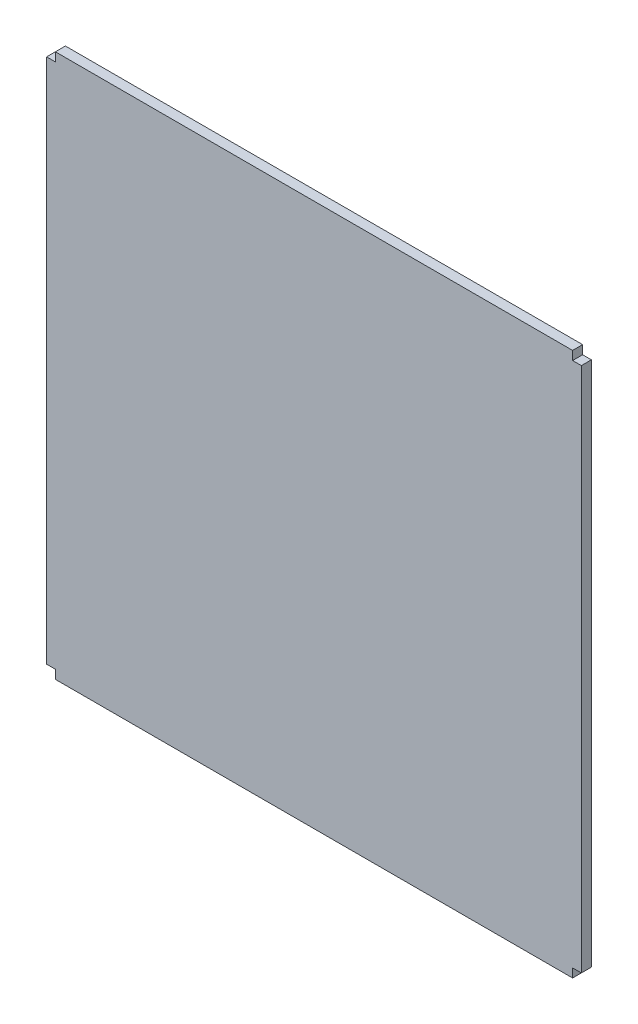
ISO-10303-21;
HEADER;
FILE_DESCRIPTION(('STEP AP214'),'2;1');
FILE_NAME('part.step','',(''),(''),'','','');
FILE_SCHEMA(('AUTOMOTIVE_DESIGN { 1 0 10303 214 1 1 1 1 }'));
ENDSEC;
DATA;
#1=APPLICATION_CONTEXT('core data for automotive mechanical design processes');
#2=APPLICATION_PROTOCOL_DEFINITION('international standard','automotive_design',2000,#1);
#3=PRODUCT_CONTEXT('',#1,'mechanical');
#4=PRODUCT('Part','Part','',(#3));
#5=PRODUCT_RELATED_PRODUCT_CATEGORY('part','',(#4));
#6=PRODUCT_DEFINITION_FORMATION('','',#4);
#7=PRODUCT_DEFINITION_CONTEXT('part definition',#1,'design');
#8=PRODUCT_DEFINITION('design','',#6,#7);
#9=PRODUCT_DEFINITION_SHAPE('','',#8);
#10=(LENGTH_UNIT() NAMED_UNIT(*) SI_UNIT(.MILLI.,.METRE.));
#11=(NAMED_UNIT(*) PLANE_ANGLE_UNIT() SI_UNIT($,.RADIAN.));
#12=(NAMED_UNIT(*) SI_UNIT($,.STERADIAN.) SOLID_ANGLE_UNIT());
#13=UNCERTAINTY_MEASURE_WITH_UNIT(LENGTH_MEASURE(1.E-05),#10,'distance_accuracy_value','');
#14=(GEOMETRIC_REPRESENTATION_CONTEXT(3) GLOBAL_UNCERTAINTY_ASSIGNED_CONTEXT((#13)) GLOBAL_UNIT_ASSIGNED_CONTEXT((#10,
#11,#12)) REPRESENTATION_CONTEXT('',''));
#15=CARTESIAN_POINT('',(0.,0.,0.));
#16=DIRECTION('',(0.,0.,1.));
#17=DIRECTION('',(1.,0.,0.));
#18=AXIS2_PLACEMENT_3D('',#15,#16,#17);
#19=CARTESIAN_POINT('',(0.,0.,8.));
#20=DIRECTION('',(0.,0.,-1.));
#21=DIRECTION('',(-1.,0.,0.));
#22=AXIS2_PLACEMENT_3D('',#19,#20,#21);
#23=PLANE('',#22);
#24=DIRECTION('',(1.,0.,0.));
#25=VECTOR('',#24,1.);
#26=CARTESIAN_POINT('',(-213.5,-210.,8.));
#27=LINE('',#26,#25);
#28=CARTESIAN_POINT('',(-213.5,-210.,8.));
#29=VERTEX_POINT('',#28);
#30=CARTESIAN_POINT('',(-206.5,-210.,8.));
#31=VERTEX_POINT('',#30);
#32=EDGE_CURVE('E141',#29,#31,#27,.T.);
#33=ORIENTED_EDGE('',*,*,#32,.T.);
#34=DIRECTION('',(0.,-1.,0.));
#35=VECTOR('',#34,1.);
#36=CARTESIAN_POINT('',(-206.5,-217.,8.));
#37=LINE('',#36,#35);
#38=CARTESIAN_POINT('',(-206.5,-217.,8.));
#39=VERTEX_POINT('',#38);
#40=EDGE_CURVE('E135',#31,#39,#37,.T.);
#41=ORIENTED_EDGE('',*,*,#40,.T.);
#42=DIRECTION('',(1.,0.,0.));
#43=VECTOR('',#42,1.);
#44=CARTESIAN_POINT('',(-213.5,-217.,8.));
#45=LINE('',#44,#43);
#46=CARTESIAN_POINT('',(206.5,-217.,8.));
#47=VERTEX_POINT('',#46);
#48=EDGE_CURVE('E11',#39,#47,#45,.T.);
#49=ORIENTED_EDGE('',*,*,#48,.T.);
#50=DIRECTION('',(0.,-1.,0.));
#51=VECTOR('',#50,1.);
#52=CARTESIAN_POINT('',(206.5,-217.,8.));
#53=LINE('',#52,#51);
#54=CARTESIAN_POINT('',(206.5,-210.,8.));
#55=VERTEX_POINT('',#54);
#56=EDGE_CURVE('E153',#55,#47,#53,.T.);
#57=ORIENTED_EDGE('',*,*,#56,.F.);
#58=DIRECTION('',(-1.,0.,0.));
#59=VECTOR('',#58,1.);
#60=CARTESIAN_POINT('',(213.5,-210.,8.));
#61=LINE('',#60,#59);
#62=CARTESIAN_POINT('',(213.5,-210.,8.));
#63=VERTEX_POINT('',#62);
#64=EDGE_CURVE('E146',#63,#55,#61,.T.);
#65=ORIENTED_EDGE('',*,*,#64,.F.);
#66=DIRECTION('',(0.,1.,0.));
#67=VECTOR('',#66,1.);
#68=CARTESIAN_POINT('',(213.5,-217.,8.));
#69=LINE('',#68,#67);
#70=CARTESIAN_POINT('',(213.5,210.,8.));
#71=VERTEX_POINT('',#70);
#72=EDGE_CURVE('E203',#63,#71,#69,.T.);
#73=ORIENTED_EDGE('',*,*,#72,.T.);
#74=DIRECTION('',(-1.,0.,0.));
#75=VECTOR('',#74,1.);
#76=CARTESIAN_POINT('',(213.5,210.,8.));
#77=LINE('',#76,#75);
#78=CARTESIAN_POINT('',(206.5,210.,8.));
#79=VERTEX_POINT('',#78);
#80=EDGE_CURVE('E169',#71,#79,#77,.T.);
#81=ORIENTED_EDGE('',*,*,#80,.T.);
#82=DIRECTION('',(0.,1.,0.));
#83=VECTOR('',#82,1.);
#84=CARTESIAN_POINT('',(206.5,217.,8.));
#85=LINE('',#84,#83);
#86=CARTESIAN_POINT('',(206.5,217.,8.));
#87=VERTEX_POINT('',#86);
#88=EDGE_CURVE('E162',#79,#87,#85,.T.);
#89=ORIENTED_EDGE('',*,*,#88,.T.);
#90=DIRECTION('',(-1.,0.,0.));
#91=VECTOR('',#90,1.);
#92=CARTESIAN_POINT('',(-213.5,217.,8.));
#93=LINE('',#92,#91);
#94=CARTESIAN_POINT('',(-206.5,217.,8.));
#95=VERTEX_POINT('',#94);
#96=EDGE_CURVE('E205',#87,#95,#93,.T.);
#97=ORIENTED_EDGE('',*,*,#96,.T.);
#98=DIRECTION('',(0.,1.,0.));
#99=VECTOR('',#98,1.);
#100=CARTESIAN_POINT('',(-206.5,217.,8.));
#101=LINE('',#100,#99);
#102=CARTESIAN_POINT('',(-206.5,210.,8.));
#103=VERTEX_POINT('',#102);
#104=EDGE_CURVE('E188',#103,#95,#101,.T.);
#105=ORIENTED_EDGE('',*,*,#104,.F.);
#106=DIRECTION('',(1.,0.,0.));
#107=VECTOR('',#106,1.);
#108=CARTESIAN_POINT('',(-213.5,210.,8.));
#109=LINE('',#108,#107);
#110=CARTESIAN_POINT('',(-213.5,210.,8.));
#111=VERTEX_POINT('',#110);
#112=EDGE_CURVE('E180',#111,#103,#109,.T.);
#113=ORIENTED_EDGE('',*,*,#112,.F.);
#114=DIRECTION('',(0.,-1.,0.));
#115=VECTOR('',#114,1.);
#116=CARTESIAN_POINT('',(-213.5,-217.,8.));
#117=LINE('',#116,#115);
#118=EDGE_CURVE('E41',#111,#29,#117,.T.);
#119=ORIENTED_EDGE('',*,*,#118,.T.);
#120=EDGE_LOOP('',(#33,#41,#49,#57,#65,#73,#81,#89,#97,#105,#113,#119));
#121=FACE_BOUND('',#120,.T.);
#122=ADVANCED_FACE('F32',(#121),#23,.F.);
#123=CARTESIAN_POINT('',(0.,0.,0.));
#124=DIRECTION('',(0.,0.,-1.));
#125=DIRECTION('',(-1.,0.,0.));
#126=AXIS2_PLACEMENT_3D('',#123,#124,#125);
#127=PLANE('',#126);
#128=DIRECTION('',(0.,-1.,0.));
#129=VECTOR('',#128,1.);
#130=CARTESIAN_POINT('',(-206.5,-217.,0.));
#131=LINE('',#130,#129);
#132=CARTESIAN_POINT('',(-206.5,-210.,0.));
#133=VERTEX_POINT('',#132);
#134=CARTESIAN_POINT('',(-206.5,-217.,0.));
#135=VERTEX_POINT('',#134);
#136=EDGE_CURVE('E49',#133,#135,#131,.T.);
#137=ORIENTED_EDGE('',*,*,#136,.F.);
#138=DIRECTION('',(1.,0.,0.));
#139=VECTOR('',#138,1.);
#140=CARTESIAN_POINT('',(-213.5,-210.,0.));
#141=LINE('',#140,#139);
#142=CARTESIAN_POINT('',(-213.5,-210.,0.));
#143=VERTEX_POINT('',#142);
#144=EDGE_CURVE('E123',#143,#133,#141,.T.);
#145=ORIENTED_EDGE('',*,*,#144,.F.);
#146=DIRECTION('',(0.,-1.,0.));
#147=VECTOR('',#146,1.);
#148=CARTESIAN_POINT('',(-213.5,-217.,0.));
#149=LINE('',#148,#147);
#150=CARTESIAN_POINT('',(-213.5,210.,0.));
#151=VERTEX_POINT('',#150);
#152=EDGE_CURVE('E211',#151,#143,#149,.T.);
#153=ORIENTED_EDGE('',*,*,#152,.F.);
#154=DIRECTION('',(1.,0.,0.));
#155=VECTOR('',#154,1.);
#156=CARTESIAN_POINT('',(-213.5,210.,0.));
#157=LINE('',#156,#155);
#158=CARTESIAN_POINT('',(-206.5,210.,0.));
#159=VERTEX_POINT('',#158);
#160=EDGE_CURVE('E184',#151,#159,#157,.T.);
#161=ORIENTED_EDGE('',*,*,#160,.T.);
#162=DIRECTION('',(0.,1.,0.));
#163=VECTOR('',#162,1.);
#164=CARTESIAN_POINT('',(-206.5,217.,0.));
#165=LINE('',#164,#163);
#166=CARTESIAN_POINT('',(-206.5,217.,0.));
#167=VERTEX_POINT('',#166);
#168=EDGE_CURVE('E187',#159,#167,#165,.T.);
#169=ORIENTED_EDGE('',*,*,#168,.T.);
#170=DIRECTION('',(-1.,0.,0.));
#171=VECTOR('',#170,1.);
#172=CARTESIAN_POINT('',(-213.5,217.,0.));
#173=LINE('',#172,#171);
#174=CARTESIAN_POINT('',(206.5,217.,0.));
#175=VERTEX_POINT('',#174);
#176=EDGE_CURVE('E210',#175,#167,#173,.T.);
#177=ORIENTED_EDGE('',*,*,#176,.F.);
#178=DIRECTION('',(0.,1.,0.));
#179=VECTOR('',#178,1.);
#180=CARTESIAN_POINT('',(206.5,217.,0.));
#181=LINE('',#180,#179);
#182=CARTESIAN_POINT('',(206.5,210.,0.));
#183=VERTEX_POINT('',#182);
#184=EDGE_CURVE('E166',#183,#175,#181,.T.);
#185=ORIENTED_EDGE('',*,*,#184,.F.);
#186=DIRECTION('',(-1.,0.,0.));
#187=VECTOR('',#186,1.);
#188=CARTESIAN_POINT('',(213.5,210.,0.));
#189=LINE('',#188,#187);
#190=CARTESIAN_POINT('',(213.5,210.,0.));
#191=VERTEX_POINT('',#190);
#192=EDGE_CURVE('E168',#191,#183,#189,.T.);
#193=ORIENTED_EDGE('',*,*,#192,.F.);
#194=DIRECTION('',(0.,1.,0.));
#195=VECTOR('',#194,1.);
#196=CARTESIAN_POINT('',(213.5,-217.,0.));
#197=LINE('',#196,#195);
#198=CARTESIAN_POINT('',(213.5,-210.,0.));
#199=VERTEX_POINT('',#198);
#200=EDGE_CURVE('E199',#199,#191,#197,.T.);
#201=ORIENTED_EDGE('',*,*,#200,.F.);
#202=DIRECTION('',(-1.,0.,0.));
#203=VECTOR('',#202,1.);
#204=CARTESIAN_POINT('',(213.5,-210.,0.));
#205=LINE('',#204,#203);
#206=CARTESIAN_POINT('',(206.5,-210.,0.));
#207=VERTEX_POINT('',#206);
#208=EDGE_CURVE('E149',#199,#207,#205,.T.);
#209=ORIENTED_EDGE('',*,*,#208,.T.);
#210=DIRECTION('',(0.,-1.,0.));
#211=VECTOR('',#210,1.);
#212=CARTESIAN_POINT('',(206.5,-217.,0.));
#213=LINE('',#212,#211);
#214=CARTESIAN_POINT('',(206.5,-217.,0.));
#215=VERTEX_POINT('',#214);
#216=EDGE_CURVE('E152',#207,#215,#213,.T.);
#217=ORIENTED_EDGE('',*,*,#216,.T.);
#218=DIRECTION('',(1.,0.,0.));
#219=VECTOR('',#218,1.);
#220=CARTESIAN_POINT('',(-213.5,-217.,0.));
#221=LINE('',#220,#219);
#222=EDGE_CURVE('E36',#135,#215,#221,.T.);
#223=ORIENTED_EDGE('',*,*,#222,.F.);
#224=EDGE_LOOP('',(#137,#145,#153,#161,#169,#177,#185,#193,#201,#209,#217,#223));
#225=FACE_BOUND('',#224,.T.);
#226=ADVANCED_FACE('F139',(#225),#127,.T.);
#227=CARTESIAN_POINT('',(-213.5,-217.,8.));
#228=DIRECTION('',(1.,0.,0.));
#229=DIRECTION('',(0.,0.,-1.));
#230=AXIS2_PLACEMENT_3D('',#227,#228,#229);
#231=PLANE('',#230);
#232=DIRECTION('',(0.,0.,1.));
#233=VECTOR('',#232,1.);
#234=CARTESIAN_POINT('',(-213.5,-210.,0.));
#235=LINE('',#234,#233);
#236=EDGE_CURVE('E128',#143,#29,#235,.T.);
#237=ORIENTED_EDGE('',*,*,#236,.T.);
#238=ORIENTED_EDGE('',*,*,#118,.F.);
#239=DIRECTION('',(0.,0.,1.));
#240=VECTOR('',#239,1.);
#241=CARTESIAN_POINT('',(-213.5,210.,0.));
#242=LINE('',#241,#240);
#243=EDGE_CURVE('E191',#151,#111,#242,.T.);
#244=ORIENTED_EDGE('',*,*,#243,.F.);
#245=ORIENTED_EDGE('',*,*,#152,.T.);
#246=EDGE_LOOP('',(#237,#238,#244,#245));
#247=FACE_BOUND('',#246,.T.);
#248=ADVANCED_FACE('F250',(#247),#231,.F.);
#249=CARTESIAN_POINT('',(-213.5,-217.,8.));
#250=DIRECTION('',(0.,1.,0.));
#251=DIRECTION('',(0.,0.,1.));
#252=AXIS2_PLACEMENT_3D('',#249,#250,#251);
#253=PLANE('',#252);
#254=DIRECTION('',(0.,0.,1.));
#255=VECTOR('',#254,1.);
#256=CARTESIAN_POINT('',(-206.5,-217.,0.));
#257=LINE('',#256,#255);
#258=EDGE_CURVE('E132',#135,#39,#257,.T.);
#259=ORIENTED_EDGE('',*,*,#258,.F.);
#260=ORIENTED_EDGE('',*,*,#222,.T.);
#261=DIRECTION('',(0.,0.,1.));
#262=VECTOR('',#261,1.);
#263=CARTESIAN_POINT('',(206.5,-217.,0.));
#264=LINE('',#263,#262);
#265=EDGE_CURVE('E159',#215,#47,#264,.T.);
#266=ORIENTED_EDGE('',*,*,#265,.T.);
#267=ORIENTED_EDGE('',*,*,#48,.F.);
#268=EDGE_LOOP('',(#259,#260,#266,#267));
#269=FACE_BOUND('',#268,.T.);
#270=ADVANCED_FACE('F216',(#269),#253,.F.);
#271=CARTESIAN_POINT('',(213.5,-217.,8.));
#272=DIRECTION('',(-1.,0.,0.));
#273=DIRECTION('',(0.,0.,1.));
#274=AXIS2_PLACEMENT_3D('',#271,#272,#273);
#275=PLANE('',#274);
#276=ORIENTED_EDGE('',*,*,#72,.F.);
#277=DIRECTION('',(0.,0.,1.));
#278=VECTOR('',#277,1.);
#279=CARTESIAN_POINT('',(213.5,-210.,0.));
#280=LINE('',#279,#278);
#281=EDGE_CURVE('E155',#199,#63,#280,.T.);
#282=ORIENTED_EDGE('',*,*,#281,.F.);
#283=ORIENTED_EDGE('',*,*,#200,.T.);
#284=DIRECTION('',(0.,0.,1.));
#285=VECTOR('',#284,1.);
#286=CARTESIAN_POINT('',(213.5,210.,0.));
#287=LINE('',#286,#285);
#288=EDGE_CURVE('E177',#191,#71,#287,.T.);
#289=ORIENTED_EDGE('',*,*,#288,.T.);
#290=EDGE_LOOP('',(#276,#282,#283,#289));
#291=FACE_BOUND('',#290,.T.);
#292=ADVANCED_FACE('F34',(#291),#275,.F.);
#293=CARTESIAN_POINT('',(-213.5,217.,8.));
#294=DIRECTION('',(0.,-1.,0.));
#295=DIRECTION('',(0.,0.,-1.));
#296=AXIS2_PLACEMENT_3D('',#293,#294,#295);
#297=PLANE('',#296);
#298=DIRECTION('',(0.,0.,1.));
#299=VECTOR('',#298,1.);
#300=CARTESIAN_POINT('',(206.5,217.,0.));
#301=LINE('',#300,#299);
#302=EDGE_CURVE('E172',#175,#87,#301,.T.);
#303=ORIENTED_EDGE('',*,*,#302,.F.);
#304=ORIENTED_EDGE('',*,*,#176,.T.);
#305=DIRECTION('',(0.,0.,1.));
#306=VECTOR('',#305,1.);
#307=CARTESIAN_POINT('',(-206.5,217.,0.));
#308=LINE('',#307,#306);
#309=EDGE_CURVE('E196',#167,#95,#308,.T.);
#310=ORIENTED_EDGE('',*,*,#309,.T.);
#311=ORIENTED_EDGE('',*,*,#96,.F.);
#312=EDGE_LOOP('',(#303,#304,#310,#311));
#313=FACE_BOUND('',#312,.T.);
#314=ADVANCED_FACE('F240',(#313),#297,.F.);
#315=CARTESIAN_POINT('',(-206.5,217.,0.));
#316=DIRECTION('',(1.,0.,0.));
#317=DIRECTION('',(0.,0.,-1.));
#318=AXIS2_PLACEMENT_3D('',#315,#316,#317);
#319=PLANE('',#318);
#320=ORIENTED_EDGE('',*,*,#104,.T.);
#321=ORIENTED_EDGE('',*,*,#309,.F.);
#322=ORIENTED_EDGE('',*,*,#168,.F.);
#323=DIRECTION('',(0.,0.,1.));
#324=VECTOR('',#323,1.);
#325=CARTESIAN_POINT('',(-206.5,210.,0.));
#326=LINE('',#325,#324);
#327=EDGE_CURVE('E200',#159,#103,#326,.T.);
#328=ORIENTED_EDGE('',*,*,#327,.T.);
#329=EDGE_LOOP('',(#320,#321,#322,#328));
#330=FACE_BOUND('',#329,.T.);
#331=ADVANCED_FACE('F244',(#330),#319,.F.);
#332=CARTESIAN_POINT('',(-213.5,210.,0.));
#333=DIRECTION('',(0.,-1.,0.));
#334=DIRECTION('',(0.,0.,-1.));
#335=AXIS2_PLACEMENT_3D('',#332,#333,#334);
#336=PLANE('',#335);
#337=ORIENTED_EDGE('',*,*,#112,.T.);
#338=ORIENTED_EDGE('',*,*,#327,.F.);
#339=ORIENTED_EDGE('',*,*,#160,.F.);
#340=ORIENTED_EDGE('',*,*,#243,.T.);
#341=EDGE_LOOP('',(#337,#338,#339,#340));
#342=FACE_BOUND('',#341,.T.);
#343=ADVANCED_FACE('F247',(#342),#336,.F.);
#344=CARTESIAN_POINT('',(213.5,210.,0.));
#345=DIRECTION('',(0.,1.,0.));
#346=DIRECTION('',(0.,0.,1.));
#347=AXIS2_PLACEMENT_3D('',#344,#345,#346);
#348=PLANE('',#347);
#349=ORIENTED_EDGE('',*,*,#80,.F.);
#350=ORIENTED_EDGE('',*,*,#288,.F.);
#351=ORIENTED_EDGE('',*,*,#192,.T.);
#352=DIRECTION('',(0.,0.,1.));
#353=VECTOR('',#352,1.);
#354=CARTESIAN_POINT('',(206.5,210.,0.));
#355=LINE('',#354,#353);
#356=EDGE_CURVE('E181',#183,#79,#355,.T.);
#357=ORIENTED_EDGE('',*,*,#356,.T.);
#358=EDGE_LOOP('',(#349,#350,#351,#357));
#359=FACE_BOUND('',#358,.T.);
#360=ADVANCED_FACE('F231',(#359),#348,.T.);
#361=CARTESIAN_POINT('',(206.5,217.,0.));
#362=DIRECTION('',(1.,0.,0.));
#363=DIRECTION('',(0.,0.,-1.));
#364=AXIS2_PLACEMENT_3D('',#361,#362,#363);
#365=PLANE('',#364);
#366=ORIENTED_EDGE('',*,*,#88,.F.);
#367=ORIENTED_EDGE('',*,*,#356,.F.);
#368=ORIENTED_EDGE('',*,*,#184,.T.);
#369=ORIENTED_EDGE('',*,*,#302,.T.);
#370=EDGE_LOOP('',(#366,#367,#368,#369));
#371=FACE_BOUND('',#370,.T.);
#372=ADVANCED_FACE('F235',(#371),#365,.T.);
#373=CARTESIAN_POINT('',(206.5,-217.,0.));
#374=DIRECTION('',(-1.,0.,0.));
#375=DIRECTION('',(0.,0.,1.));
#376=AXIS2_PLACEMENT_3D('',#373,#374,#375);
#377=PLANE('',#376);
#378=ORIENTED_EDGE('',*,*,#56,.T.);
#379=ORIENTED_EDGE('',*,*,#265,.F.);
#380=ORIENTED_EDGE('',*,*,#216,.F.);
#381=DIRECTION('',(0.,0.,1.));
#382=VECTOR('',#381,1.);
#383=CARTESIAN_POINT('',(206.5,-210.,0.));
#384=LINE('',#383,#382);
#385=EDGE_CURVE('E163',#207,#55,#384,.T.);
#386=ORIENTED_EDGE('',*,*,#385,.T.);
#387=EDGE_LOOP('',(#378,#379,#380,#386));
#388=FACE_BOUND('',#387,.T.);
#389=ADVANCED_FACE('F219',(#388),#377,.F.);
#390=CARTESIAN_POINT('',(213.5,-210.,0.));
#391=DIRECTION('',(0.,1.,0.));
#392=DIRECTION('',(0.,0.,1.));
#393=AXIS2_PLACEMENT_3D('',#390,#391,#392);
#394=PLANE('',#393);
#395=ORIENTED_EDGE('',*,*,#64,.T.);
#396=ORIENTED_EDGE('',*,*,#385,.F.);
#397=ORIENTED_EDGE('',*,*,#208,.F.);
#398=ORIENTED_EDGE('',*,*,#281,.T.);
#399=EDGE_LOOP('',(#395,#396,#397,#398));
#400=FACE_BOUND('',#399,.T.);
#401=ADVANCED_FACE('F224',(#400),#394,.F.);
#402=CARTESIAN_POINT('',(-213.5,-210.,0.));
#403=DIRECTION('',(0.,-1.,0.));
#404=DIRECTION('',(0.,0.,-1.));
#405=AXIS2_PLACEMENT_3D('',#402,#403,#404);
#406=PLANE('',#405);
#407=ORIENTED_EDGE('',*,*,#32,.F.);
#408=ORIENTED_EDGE('',*,*,#236,.F.);
#409=ORIENTED_EDGE('',*,*,#144,.T.);
#410=DIRECTION('',(0.,0.,1.));
#411=VECTOR('',#410,1.);
#412=CARTESIAN_POINT('',(-206.5,-210.,0.));
#413=LINE('',#412,#411);
#414=EDGE_CURVE('E125',#133,#31,#413,.T.);
#415=ORIENTED_EDGE('',*,*,#414,.T.);
#416=EDGE_LOOP('',(#407,#408,#409,#415));
#417=FACE_BOUND('',#416,.T.);
#418=ADVANCED_FACE('F124',(#417),#406,.T.);
#419=CARTESIAN_POINT('',(-206.5,-217.,0.));
#420=DIRECTION('',(-1.,0.,0.));
#421=DIRECTION('',(0.,0.,1.));
#422=AXIS2_PLACEMENT_3D('',#419,#420,#421);
#423=PLANE('',#422);
#424=ORIENTED_EDGE('',*,*,#40,.F.);
#425=ORIENTED_EDGE('',*,*,#414,.F.);
#426=ORIENTED_EDGE('',*,*,#136,.T.);
#427=ORIENTED_EDGE('',*,*,#258,.T.);
#428=EDGE_LOOP('',(#424,#425,#426,#427));
#429=FACE_BOUND('',#428,.T.);
#430=ADVANCED_FACE('F134',(#429),#423,.T.);
#431=CLOSED_SHELL('',(#122,#226,#248,#270,#292,#314,#331,#343,#360,#372,#389,#401,#418,#430));
#432=MANIFOLD_SOLID_BREP('B2',#431);
#433=ADVANCED_BREP_SHAPE_REPRESENTATION('',(#18,#432),#14);
#434=SHAPE_DEFINITION_REPRESENTATION(#9,#433);
ENDSEC;
END-ISO-10303-21;
